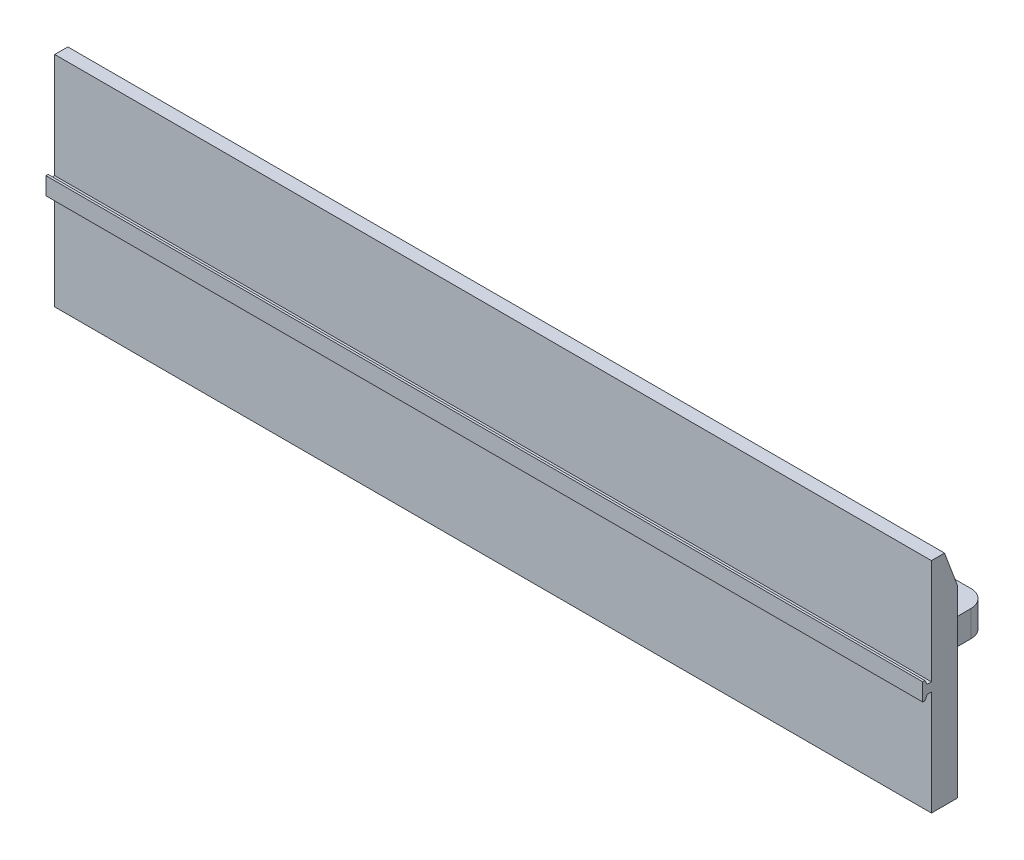
ISO-10303-21;
HEADER;
FILE_DESCRIPTION(('STEP AP214'),'2;1');
FILE_NAME('part.step','',(''),(''),'','','');
FILE_SCHEMA(('AUTOMOTIVE_DESIGN { 1 0 10303 214 1 1 1 1 }'));
ENDSEC;
DATA;
#1=APPLICATION_CONTEXT('core data for automotive mechanical design processes');
#2=APPLICATION_PROTOCOL_DEFINITION('international standard','automotive_design',2000,#1);
#3=PRODUCT_CONTEXT('',#1,'mechanical');
#4=PRODUCT('Part','Part','',(#3));
#5=PRODUCT_RELATED_PRODUCT_CATEGORY('part','',(#4));
#6=PRODUCT_DEFINITION_FORMATION('','',#4);
#7=PRODUCT_DEFINITION_CONTEXT('part definition',#1,'design');
#8=PRODUCT_DEFINITION('design','',#6,#7);
#9=PRODUCT_DEFINITION_SHAPE('','',#8);
#10=(LENGTH_UNIT() NAMED_UNIT(*) SI_UNIT(.MILLI.,.METRE.));
#11=(NAMED_UNIT(*) PLANE_ANGLE_UNIT() SI_UNIT($,.RADIAN.));
#12=(NAMED_UNIT(*) SI_UNIT($,.STERADIAN.) SOLID_ANGLE_UNIT());
#13=UNCERTAINTY_MEASURE_WITH_UNIT(LENGTH_MEASURE(1.E-05),#10,'distance_accuracy_value','');
#14=(GEOMETRIC_REPRESENTATION_CONTEXT(3) GLOBAL_UNCERTAINTY_ASSIGNED_CONTEXT((#13)) GLOBAL_UNIT_ASSIGNED_CONTEXT((#10,
#11,#12)) REPRESENTATION_CONTEXT('',''));
#15=CARTESIAN_POINT('',(0.,0.,0.));
#16=DIRECTION('',(0.,0.,1.));
#17=DIRECTION('',(1.,0.,0.));
#18=AXIS2_PLACEMENT_3D('',#15,#16,#17);
#19=CARTESIAN_POINT('',(24.9999999999992,80.,74.9999999999982));
#20=DIRECTION('',(0.,1.,0.));
#21=DIRECTION('',(0.,0.,1.));
#22=AXIS2_PLACEMENT_3D('',#19,#20,#21);
#23=PLANE('',#22);
#24=DIRECTION('',(1.,0.,0.));
#25=VECTOR('',#24,1.);
#26=CARTESIAN_POINT('',(24.9999999999997,80.,-110.000000000002));
#27=LINE('',#26,#25);
#28=CARTESIAN_POINT('',(195.,80.,-110.000000000001));
#29=VERTEX_POINT('',#28);
#30=CARTESIAN_POINT('',(306.25,80.,-110.000000000001));
#31=VERTEX_POINT('',#30);
#32=EDGE_CURVE('E425',#29,#31,#27,.T.);
#33=ORIENTED_EDGE('',*,*,#32,.F.);
#34=CARTESIAN_POINT('',(195.,80.,-90.0000000000015));
#35=DIRECTION('',(0.,1.,0.));
#36=DIRECTION('',(0.,0.,1.));
#37=AXIS2_PLACEMENT_3D('',#34,#35,#36);
#38=CIRCLE('',#37,20.);
#39=CARTESIAN_POINT('',(175.,80.,-90.0000000000014));
#40=VERTEX_POINT('',#39);
#41=EDGE_CURVE('E455',#29,#40,#38,.T.);
#42=ORIENTED_EDGE('',*,*,#41,.T.);
#43=DIRECTION('',(0.,0.,-1.));
#44=VECTOR('',#43,1.);
#45=CARTESIAN_POINT('',(175.,80.,74.9999999999982));
#46=LINE('',#45,#44);
#47=CARTESIAN_POINT('',(175.,80.,74.9999999999982));
#48=VERTEX_POINT('',#47);
#49=EDGE_CURVE('E314',#48,#40,#46,.T.);
#50=ORIENTED_EDGE('',*,*,#49,.F.);
#51=DIRECTION('',(1.,0.,0.));
#52=VECTOR('',#51,1.);
#53=CARTESIAN_POINT('',(24.9999999999992,80.,74.9999999999982));
#54=LINE('',#53,#52);
#55=CARTESIAN_POINT('',(240.625,80.,74.9999999999987));
#56=VERTEX_POINT('',#55);
#57=EDGE_CURVE('E418',#48,#56,#54,.T.);
#58=ORIENTED_EDGE('',*,*,#57,.T.);
#59=DIRECTION('',(0.,0.,-1.));
#60=VECTOR('',#59,1.);
#61=CARTESIAN_POINT('',(240.625,80.,74.9999999999982));
#62=LINE('',#61,#60);
#63=CARTESIAN_POINT('',(240.625,80.,15.0000000000006));
#64=VERTEX_POINT('',#63);
#65=EDGE_CURVE('E250',#56,#64,#62,.T.);
#66=ORIENTED_EDGE('',*,*,#65,.T.);
#67=DIRECTION('',(1.,0.,0.));
#68=VECTOR('',#67,1.);
#69=CARTESIAN_POINT('',(24.9999999999992,80.,15.0000000000006));
#70=LINE('',#69,#68);
#71=CARTESIAN_POINT('',(260.625,80.,15.0000000000006));
#72=VERTEX_POINT('',#71);
#73=EDGE_CURVE('E263',#72,#64,#70,.F.);
#74=ORIENTED_EDGE('',*,*,#73,.F.);
#75=DIRECTION('',(0.,0.,-1.));
#76=VECTOR('',#75,1.);
#77=CARTESIAN_POINT('',(260.625,80.,74.9999999999982));
#78=LINE('',#77,#76);
#79=CARTESIAN_POINT('',(260.625,80.,74.9999999999987));
#80=VERTEX_POINT('',#79);
#81=EDGE_CURVE('E269',#80,#72,#78,.T.);
#82=ORIENTED_EDGE('',*,*,#81,.F.);
#83=CARTESIAN_POINT('',(326.25,80.,75.0000000000004));
#84=VERTEX_POINT('',#83);
#85=EDGE_CURVE('E420',#80,#84,#54,.T.);
#86=ORIENTED_EDGE('',*,*,#85,.T.);
#87=DIRECTION('',(0.,0.,1.));
#88=VECTOR('',#87,1.);
#89=CARTESIAN_POINT('',(326.25,80.,74.9999999999982));
#90=LINE('',#89,#88);
#91=CARTESIAN_POINT('',(326.25,80.,-90.0000000000012));
#92=VERTEX_POINT('',#91);
#93=EDGE_CURVE('E332',#92,#84,#90,.T.);
#94=ORIENTED_EDGE('',*,*,#93,.F.);
#95=CARTESIAN_POINT('',(306.25,80.,-90.0000000000012));
#96=DIRECTION('',(0.,1.,0.));
#97=DIRECTION('',(0.,0.,1.));
#98=AXIS2_PLACEMENT_3D('',#95,#96,#97);
#99=CIRCLE('',#98,20.);
#100=EDGE_CURVE('E453',#92,#31,#99,.T.);
#101=ORIENTED_EDGE('',*,*,#100,.T.);
#102=EDGE_LOOP('',(#33,#42,#50,#58,#66,#74,#82,#86,#94,#101));
#103=FACE_BOUND('',#102,.T.);
#104=ADVANCED_FACE('F41',(#103),#23,.T.);
#105=CARTESIAN_POINT('',(24.9999999999997,50.,-110.000000000002));
#106=DIRECTION('',(0.,0.,-1.));
#107=DIRECTION('',(-1.,0.,0.));
#108=AXIS2_PLACEMENT_3D('',#105,#106,#107);
#109=PLANE('',#108);
#110=DIRECTION('',(1.,0.,0.));
#111=VECTOR('',#110,1.);
#112=CARTESIAN_POINT('',(24.9999999999997,50.,-110.000000000002));
#113=LINE('',#112,#111);
#114=CARTESIAN_POINT('',(195.,50.,-110.000000000001));
#115=VERTEX_POINT('',#114);
#116=CARTESIAN_POINT('',(306.25,50.,-110.000000000001));
#117=VERTEX_POINT('',#116);
#118=EDGE_CURVE('E426',#115,#117,#113,.T.);
#119=ORIENTED_EDGE('',*,*,#118,.F.);
#120=DIRECTION('',(0.,1.,0.));
#121=VECTOR('',#120,1.);
#122=CARTESIAN_POINT('',(195.,80.,-110.000000000001));
#123=LINE('',#122,#121);
#124=EDGE_CURVE('E450',#115,#29,#123,.T.);
#125=ORIENTED_EDGE('',*,*,#124,.T.);
#126=ORIENTED_EDGE('',*,*,#32,.T.);
#127=DIRECTION('',(0.,1.,0.));
#128=VECTOR('',#127,1.);
#129=CARTESIAN_POINT('',(306.25,50.,-110.000000000001));
#130=LINE('',#129,#128);
#131=EDGE_CURVE('E415',#31,#117,#130,.F.);
#132=ORIENTED_EDGE('',*,*,#131,.T.);
#133=EDGE_LOOP('',(#119,#125,#126,#132));
#134=FACE_BOUND('',#133,.T.);
#135=ADVANCED_FACE('F530',(#134),#109,.T.);
#136=CARTESIAN_POINT('',(24.9999999999992,300.,104.999999999998));
#137=DIRECTION('',(0.,1.,0.));
#138=DIRECTION('',(0.,0.,1.));
#139=AXIS2_PLACEMENT_3D('',#136,#137,#138);
#140=PLANE('',#139);
#141=DIRECTION('',(0.,0.,1.));
#142=VECTOR('',#141,1.);
#143=CARTESIAN_POINT('',(1027.5,300.,105.));
#144=LINE('',#143,#142);
#145=CARTESIAN_POINT('',(1027.5,300.,90.0000000000003));
#146=VERTEX_POINT('',#145);
#147=CARTESIAN_POINT('',(1027.5,300.,105.));
#148=VERTEX_POINT('',#147);
#149=EDGE_CURVE('E334',#146,#148,#144,.T.);
#150=ORIENTED_EDGE('',*,*,#149,.F.);
#151=DIRECTION('',(1.,0.,0.));
#152=VECTOR('',#151,1.);
#153=CARTESIAN_POINT('',(24.9999999999992,300.,89.9999999999981));
#154=LINE('',#153,#152);
#155=CARTESIAN_POINT('',(24.9999999999992,300.,89.9999999999981));
#156=VERTEX_POINT('',#155);
#157=EDGE_CURVE('E413',#156,#146,#154,.T.);
#158=ORIENTED_EDGE('',*,*,#157,.F.);
#159=DIRECTION('',(0.,0.,1.));
#160=VECTOR('',#159,1.);
#161=CARTESIAN_POINT('',(24.9999999999992,300.,104.999999999998));
#162=LINE('',#161,#160);
#163=CARTESIAN_POINT('',(24.9999999999992,300.,104.999999999998));
#164=VERTEX_POINT('',#163);
#165=EDGE_CURVE('E335',#156,#164,#162,.T.);
#166=ORIENTED_EDGE('',*,*,#165,.T.);
#167=DIRECTION('',(1.,0.,0.));
#168=VECTOR('',#167,1.);
#169=CARTESIAN_POINT('',(24.9999999999992,300.,104.999999999998));
#170=LINE('',#169,#168);
#171=EDGE_CURVE('E375',#164,#148,#170,.T.);
#172=ORIENTED_EDGE('',*,*,#171,.T.);
#173=EDGE_LOOP('',(#150,#158,#166,#172));
#174=FACE_BOUND('',#173,.T.);
#175=ADVANCED_FACE('F558',(#174),#140,.T.);
#176=CARTESIAN_POINT('',(24.9999999999992,300.,89.9999999999981));
#177=DIRECTION('',(0.,0.351123441588388,-0.936329177569046));
#178=DIRECTION('',(0.,0.936329177569046,0.351123441588388));
#179=AXIS2_PLACEMENT_3D('',#176,#177,#178);
#180=PLANE('',#179);
#181=DIRECTION('',(0.,0.936329177569046,0.351123441588388));
#182=VECTOR('',#181,1.);
#183=CARTESIAN_POINT('',(1027.5,300.,90.0000000000003));
#184=LINE('',#183,#182);
#185=CARTESIAN_POINT('',(1027.5,260.,75.0000000000004));
#186=VERTEX_POINT('',#185);
#187=EDGE_CURVE('E339',#186,#146,#184,.T.);
#188=ORIENTED_EDGE('',*,*,#187,.F.);
#189=DIRECTION('',(1.,0.,0.));
#190=VECTOR('',#189,1.);
#191=CARTESIAN_POINT('',(24.9999999999992,260.,74.9999999999982));
#192=LINE('',#191,#190);
#193=CARTESIAN_POINT('',(24.9999999999992,260.,74.9999999999982));
#194=VERTEX_POINT('',#193);
#195=EDGE_CURVE('E416',#194,#186,#192,.T.);
#196=ORIENTED_EDGE('',*,*,#195,.F.);
#197=DIRECTION('',(0.,0.936329177569046,0.351123441588388));
#198=VECTOR('',#197,1.);
#199=CARTESIAN_POINT('',(24.9999999999992,300.,89.9999999999981));
#200=LINE('',#199,#198);
#201=EDGE_CURVE('E372',#194,#156,#200,.T.);
#202=ORIENTED_EDGE('',*,*,#201,.T.);
#203=ORIENTED_EDGE('',*,*,#157,.T.);
#204=EDGE_LOOP('',(#188,#196,#202,#203));
#205=FACE_BOUND('',#204,.T.);
#206=ADVANCED_FACE('F566',(#205),#180,.T.);
#207=CARTESIAN_POINT('',(24.9999999999992,260.,74.9999999999982));
#208=DIRECTION('',(0.,0.,-1.));
#209=DIRECTION('',(-1.,0.,0.));
#210=AXIS2_PLACEMENT_3D('',#207,#208,#209);
#211=PLANE('',#210);
#212=DIRECTION('',(0.,-1.,0.));
#213=VECTOR('',#212,1.);
#214=CARTESIAN_POINT('',(260.625,260.,74.9999999999987));
#215=LINE('',#214,#213);
#216=CARTESIAN_POINT('',(260.625,179.999999999997,74.9999999999987));
#217=VERTEX_POINT('',#216);
#218=EDGE_CURVE('E268',#217,#80,#215,.T.);
#219=ORIENTED_EDGE('',*,*,#218,.F.);
#220=DIRECTION('',(-1.,0.,0.));
#221=VECTOR('',#220,1.);
#222=CARTESIAN_POINT('',(24.9999999999996,179.999999999996,74.9999999999982));
#223=LINE('',#222,#221);
#224=CARTESIAN_POINT('',(240.625,179.999999999997,74.9999999999987));
#225=VERTEX_POINT('',#224);
#226=EDGE_CURVE('E260',#225,#217,#223,.F.);
#227=ORIENTED_EDGE('',*,*,#226,.F.);
#228=DIRECTION('',(0.,-1.,0.));
#229=VECTOR('',#228,1.);
#230=CARTESIAN_POINT('',(240.625,260.,74.9999999999987));
#231=LINE('',#230,#229);
#232=EDGE_CURVE('E245',#225,#56,#231,.T.);
#233=ORIENTED_EDGE('',*,*,#232,.T.);
#234=ORIENTED_EDGE('',*,*,#57,.F.);
#235=DIRECTION('',(0.,1.,0.));
#236=VECTOR('',#235,1.);
#237=CARTESIAN_POINT('',(175.,50.,74.9999999999982));
#238=LINE('',#237,#236);
#239=CARTESIAN_POINT('',(175.,50.,74.9999999999982));
#240=VERTEX_POINT('',#239);
#241=EDGE_CURVE('E304',#240,#48,#238,.T.);
#242=ORIENTED_EDGE('',*,*,#241,.F.);
#243=DIRECTION('',(1.,0.,0.));
#244=VECTOR('',#243,1.);
#245=CARTESIAN_POINT('',(24.9999999999997,50.,74.9999999999982));
#246=LINE('',#245,#244);
#247=CARTESIAN_POINT('',(24.9999999999992,50.,74.9999999999982));
#248=VERTEX_POINT('',#247);
#249=EDGE_CURVE('E297',#248,#240,#246,.T.);
#250=ORIENTED_EDGE('',*,*,#249,.F.);
#251=DIRECTION('',(0.,1.,0.));
#252=VECTOR('',#251,1.);
#253=CARTESIAN_POINT('',(24.9999999999992,260.,74.9999999999982));
#254=LINE('',#253,#252);
#255=EDGE_CURVE('E369',#248,#194,#254,.T.);
#256=ORIENTED_EDGE('',*,*,#255,.T.);
#257=ORIENTED_EDGE('',*,*,#195,.T.);
#258=DIRECTION('',(0.,1.,0.));
#259=VECTOR('',#258,1.);
#260=CARTESIAN_POINT('',(1027.5,260.,75.0000000000004));
#261=LINE('',#260,#259);
#262=CARTESIAN_POINT('',(1027.5,50.,75.0000000000005));
#263=VERTEX_POINT('',#262);
#264=EDGE_CURVE('E408',#263,#186,#261,.T.);
#265=ORIENTED_EDGE('',*,*,#264,.F.);
#266=DIRECTION('',(1.,0.,0.));
#267=VECTOR('',#266,1.);
#268=CARTESIAN_POINT('',(1027.5,50.,75.0000000000005));
#269=LINE('',#268,#267);
#270=CARTESIAN_POINT('',(877.5,50.,75.0000000000004));
#271=VERTEX_POINT('',#270);
#272=EDGE_CURVE('E309',#271,#263,#269,.T.);
#273=ORIENTED_EDGE('',*,*,#272,.F.);
#274=DIRECTION('',(0.,1.,0.));
#275=VECTOR('',#274,1.);
#276=CARTESIAN_POINT('',(877.5,50.,75.0000000000004));
#277=LINE('',#276,#275);
#278=CARTESIAN_POINT('',(877.5,80.,75.0000000000004));
#279=VERTEX_POINT('',#278);
#280=EDGE_CURVE('E296',#271,#279,#277,.T.);
#281=ORIENTED_EDGE('',*,*,#280,.T.);
#282=CARTESIAN_POINT('',(811.875,80.,75.0000000000004));
#283=VERTEX_POINT('',#282);
#284=EDGE_CURVE('E495',#283,#279,#54,.T.);
#285=ORIENTED_EDGE('',*,*,#284,.F.);
#286=DIRECTION('',(0.,-1.,0.));
#287=VECTOR('',#286,1.);
#288=CARTESIAN_POINT('',(811.875,260.,75.));
#289=LINE('',#288,#287);
#290=CARTESIAN_POINT('',(811.875,179.999999999999,74.9999999999999));
#291=VERTEX_POINT('',#290);
#292=EDGE_CURVE('E289',#291,#283,#289,.T.);
#293=ORIENTED_EDGE('',*,*,#292,.F.);
#294=DIRECTION('',(1.,0.,0.));
#295=VECTOR('',#294,1.);
#296=CARTESIAN_POINT('',(24.9999999999995,179.999999999996,74.9999999999982));
#297=LINE('',#296,#295);
#298=CARTESIAN_POINT('',(791.875,179.999999999999,74.9999999999999));
#299=VERTEX_POINT('',#298);
#300=EDGE_CURVE('E294',#299,#291,#297,.T.);
#301=ORIENTED_EDGE('',*,*,#300,.F.);
#302=DIRECTION('',(0.,-1.,0.));
#303=VECTOR('',#302,1.);
#304=CARTESIAN_POINT('',(791.875,260.,74.9999999999999));
#305=LINE('',#304,#303);
#306=CARTESIAN_POINT('',(791.875,80.,75.0000000000004));
#307=VERTEX_POINT('',#306);
#308=EDGE_CURVE('E284',#299,#307,#305,.T.);
#309=ORIENTED_EDGE('',*,*,#308,.T.);
#310=CARTESIAN_POINT('',(726.25,80.,75.0000000000004));
#311=VERTEX_POINT('',#310);
#312=EDGE_CURVE('E421',#311,#307,#54,.T.);
#313=ORIENTED_EDGE('',*,*,#312,.F.);
#314=DIRECTION('',(0.,1.,0.));
#315=VECTOR('',#314,1.);
#316=CARTESIAN_POINT('',(726.25,50.,75.0000000000004));
#317=LINE('',#316,#315);
#318=CARTESIAN_POINT('',(726.25,50.,75.0000000000004));
#319=VERTEX_POINT('',#318);
#320=EDGE_CURVE('E326',#319,#311,#317,.T.);
#321=ORIENTED_EDGE('',*,*,#320,.F.);
#322=DIRECTION('',(1.,0.,0.));
#323=VECTOR('',#322,1.);
#324=CARTESIAN_POINT('',(326.25,50.,75.0000000000004));
#325=LINE('',#324,#323);
#326=CARTESIAN_POINT('',(326.25,50.,75.0000000000004));
#327=VERTEX_POINT('',#326);
#328=EDGE_CURVE('E319',#327,#319,#325,.T.);
#329=ORIENTED_EDGE('',*,*,#328,.F.);
#330=DIRECTION('',(0.,1.,0.));
#331=VECTOR('',#330,1.);
#332=CARTESIAN_POINT('',(326.25,50.,75.0000000000004));
#333=LINE('',#332,#331);
#334=EDGE_CURVE('E325',#327,#84,#333,.T.);
#335=ORIENTED_EDGE('',*,*,#334,.T.);
#336=ORIENTED_EDGE('',*,*,#85,.F.);
#337=EDGE_LOOP('',(#219,#227,#233,#234,#242,#250,#256,#257,#265,#273,#281,#285,#293,#301,#309,
#313,#321,#329,#335,#336));
#338=FACE_BOUND('',#337,.T.);
#339=ADVANCED_FACE('F266',(#338),#211,.T.);
#340=CARTESIAN_POINT('',(746.25,80.,-110.));
#341=VERTEX_POINT('',#340);
#342=CARTESIAN_POINT('',(857.5,80.,-110.));
#343=VERTEX_POINT('',#342);
#344=EDGE_CURVE('E422',#341,#343,#27,.T.);
#345=ORIENTED_EDGE('',*,*,#344,.F.);
#346=CARTESIAN_POINT('',(746.25,80.,-90.0000000000002));
#347=DIRECTION('',(0.,1.,0.));
#348=DIRECTION('',(0.,0.,1.));
#349=AXIS2_PLACEMENT_3D('',#346,#347,#348);
#350=CIRCLE('',#349,20.);
#351=CARTESIAN_POINT('',(726.25,80.,-90.0000000000002));
#352=VERTEX_POINT('',#351);
#353=EDGE_CURVE('E56',#341,#352,#350,.T.);
#354=ORIENTED_EDGE('',*,*,#353,.T.);
#355=DIRECTION('',(0.,0.,-1.));
#356=VECTOR('',#355,1.);
#357=CARTESIAN_POINT('',(726.25,80.,74.9999999999982));
#358=LINE('',#357,#356);
#359=EDGE_CURVE('E328',#311,#352,#358,.T.);
#360=ORIENTED_EDGE('',*,*,#359,.F.);
#361=ORIENTED_EDGE('',*,*,#312,.T.);
#362=DIRECTION('',(0.,0.,-1.));
#363=VECTOR('',#362,1.);
#364=CARTESIAN_POINT('',(791.875,80.,74.9999999999982));
#365=LINE('',#364,#363);
#366=CARTESIAN_POINT('',(791.875,80.,15.0000000000005));
#367=VERTEX_POINT('',#366);
#368=EDGE_CURVE('E279',#307,#367,#365,.T.);
#369=ORIENTED_EDGE('',*,*,#368,.T.);
#370=DIRECTION('',(-1.,0.,0.));
#371=VECTOR('',#370,1.);
#372=CARTESIAN_POINT('',(24.9999999999992,80.,15.0000000000005));
#373=LINE('',#372,#371);
#374=CARTESIAN_POINT('',(811.875,80.,15.0000000000005));
#375=VERTEX_POINT('',#374);
#376=EDGE_CURVE('E291',#375,#367,#373,.T.);
#377=ORIENTED_EDGE('',*,*,#376,.F.);
#378=DIRECTION('',(0.,0.,-1.));
#379=VECTOR('',#378,1.);
#380=CARTESIAN_POINT('',(811.875,80.,74.9999999999982));
#381=LINE('',#380,#379);
#382=EDGE_CURVE('E287',#283,#375,#381,.T.);
#383=ORIENTED_EDGE('',*,*,#382,.F.);
#384=ORIENTED_EDGE('',*,*,#284,.T.);
#385=DIRECTION('',(0.,0.,1.));
#386=VECTOR('',#385,1.);
#387=CARTESIAN_POINT('',(877.5,80.,74.9999999999972));
#388=LINE('',#387,#386);
#389=CARTESIAN_POINT('',(877.5,80.,-90.));
#390=VERTEX_POINT('',#389);
#391=EDGE_CURVE('E306',#390,#279,#388,.T.);
#392=ORIENTED_EDGE('',*,*,#391,.F.);
#393=CARTESIAN_POINT('',(857.5,80.,-90.));
#394=DIRECTION('',(0.,1.,0.));
#395=DIRECTION('',(0.,0.,1.));
#396=AXIS2_PLACEMENT_3D('',#393,#394,#395);
#397=CIRCLE('',#396,20.);
#398=EDGE_CURVE('E64',#390,#343,#397,.T.);
#399=ORIENTED_EDGE('',*,*,#398,.T.);
#400=EDGE_LOOP('',(#345,#354,#360,#361,#369,#377,#383,#384,#392,#399));
#401=FACE_BOUND('',#400,.T.);
#402=ADVANCED_FACE('F490',(#401),#23,.T.);
#403=CARTESIAN_POINT('',(746.25,50.,-110.));
#404=VERTEX_POINT('',#403);
#405=CARTESIAN_POINT('',(857.5,50.,-110.));
#406=VERTEX_POINT('',#405);
#407=EDGE_CURVE('E427',#404,#406,#113,.T.);
#408=ORIENTED_EDGE('',*,*,#407,.F.);
#409=DIRECTION('',(0.,1.,0.));
#410=VECTOR('',#409,1.);
#411=CARTESIAN_POINT('',(746.25,80.,-110.));
#412=LINE('',#411,#410);
#413=EDGE_CURVE('E472',#404,#341,#412,.T.);
#414=ORIENTED_EDGE('',*,*,#413,.T.);
#415=ORIENTED_EDGE('',*,*,#344,.T.);
#416=DIRECTION('',(0.,1.,0.));
#417=VECTOR('',#416,1.);
#418=CARTESIAN_POINT('',(857.5,50.,-110.));
#419=LINE('',#418,#417);
#420=EDGE_CURVE('E470',#343,#406,#419,.F.);
#421=ORIENTED_EDGE('',*,*,#420,.T.);
#422=EDGE_LOOP('',(#408,#414,#415,#421));
#423=FACE_BOUND('',#422,.T.);
#424=ADVANCED_FACE('F489',(#423),#109,.T.);
#425=CARTESIAN_POINT('',(24.9999999999992,50.,74.9999999999982));
#426=DIRECTION('',(0.,-1.,0.));
#427=DIRECTION('',(0.,0.,-1.));
#428=AXIS2_PLACEMENT_3D('',#425,#426,#427);
#429=PLANE('',#428);
#430=DIRECTION('',(0.,0.,-1.));
#431=VECTOR('',#430,1.);
#432=CARTESIAN_POINT('',(175.,50.,-110.000000000002));
#433=LINE('',#432,#431);
#434=CARTESIAN_POINT('',(175.,50.,-90.0000000000015));
#435=VERTEX_POINT('',#434);
#436=EDGE_CURVE('E300',#240,#435,#433,.T.);
#437=ORIENTED_EDGE('',*,*,#436,.T.);
#438=CARTESIAN_POINT('',(195.,50.,-90.0000000000015));
#439=DIRECTION('',(0.,-1.,0.));
#440=DIRECTION('',(0.,0.,-1.));
#441=AXIS2_PLACEMENT_3D('',#438,#439,#440);
#442=CIRCLE('',#441,20.);
#443=EDGE_CURVE('E465',#435,#115,#442,.T.);
#444=ORIENTED_EDGE('',*,*,#443,.T.);
#445=ORIENTED_EDGE('',*,*,#118,.T.);
#446=CARTESIAN_POINT('',(306.25,50.,-90.0000000000012));
#447=DIRECTION('',(0.,-1.,0.));
#448=DIRECTION('',(0.,0.,-1.));
#449=AXIS2_PLACEMENT_3D('',#446,#447,#448);
#450=CIRCLE('',#449,20.);
#451=CARTESIAN_POINT('',(326.25,50.,-90.0000000000012));
#452=VERTEX_POINT('',#451);
#453=EDGE_CURVE('E463',#117,#452,#450,.T.);
#454=ORIENTED_EDGE('',*,*,#453,.T.);
#455=DIRECTION('',(0.,0.,1.));
#456=VECTOR('',#455,1.);
#457=CARTESIAN_POINT('',(326.25,50.,-110.000000000002));
#458=LINE('',#457,#456);
#459=EDGE_CURVE('E317',#452,#327,#458,.T.);
#460=ORIENTED_EDGE('',*,*,#459,.T.);
#461=ORIENTED_EDGE('',*,*,#328,.T.);
#462=DIRECTION('',(0.,0.,-1.));
#463=VECTOR('',#462,1.);
#464=CARTESIAN_POINT('',(726.25,50.,-110.000000000002));
#465=LINE('',#464,#463);
#466=CARTESIAN_POINT('',(726.25,50.,-90.0000000000002));
#467=VERTEX_POINT('',#466);
#468=EDGE_CURVE('E322',#319,#467,#465,.T.);
#469=ORIENTED_EDGE('',*,*,#468,.T.);
#470=CARTESIAN_POINT('',(746.25,50.,-90.0000000000002));
#471=DIRECTION('',(0.,-1.,0.));
#472=DIRECTION('',(0.,0.,-1.));
#473=AXIS2_PLACEMENT_3D('',#470,#471,#472);
#474=CIRCLE('',#473,20.);
#475=EDGE_CURVE('E461',#467,#404,#474,.T.);
#476=ORIENTED_EDGE('',*,*,#475,.T.);
#477=ORIENTED_EDGE('',*,*,#407,.T.);
#478=CARTESIAN_POINT('',(857.5,50.,-90.));
#479=DIRECTION('',(0.,-1.,0.));
#480=DIRECTION('',(0.,0.,-1.));
#481=AXIS2_PLACEMENT_3D('',#478,#479,#480);
#482=CIRCLE('',#481,20.);
#483=CARTESIAN_POINT('',(877.5,50.,-90.));
#484=VERTEX_POINT('',#483);
#485=EDGE_CURVE('E459',#406,#484,#482,.T.);
#486=ORIENTED_EDGE('',*,*,#485,.T.);
#487=DIRECTION('',(0.,0.,1.));
#488=VECTOR('',#487,1.);
#489=CARTESIAN_POINT('',(877.5,50.,-110.));
#490=LINE('',#489,#488);
#491=EDGE_CURVE('E301',#484,#271,#490,.T.);
#492=ORIENTED_EDGE('',*,*,#491,.T.);
#493=ORIENTED_EDGE('',*,*,#272,.T.);
#494=DIRECTION('',(0.,0.,-1.));
#495=VECTOR('',#494,1.);
#496=CARTESIAN_POINT('',(1027.5,50.,75.0000000000005));
#497=LINE('',#496,#495);
#498=CARTESIAN_POINT('',(1027.5,50.,105.));
#499=VERTEX_POINT('',#498);
#500=EDGE_CURVE('E405',#499,#263,#497,.T.);
#501=ORIENTED_EDGE('',*,*,#500,.F.);
#502=DIRECTION('',(1.,0.,0.));
#503=VECTOR('',#502,1.);
#504=CARTESIAN_POINT('',(24.9999999999992,50.,104.999999999998));
#505=LINE('',#504,#503);
#506=CARTESIAN_POINT('',(24.9999999999992,50.,104.999999999998));
#507=VERTEX_POINT('',#506);
#508=EDGE_CURVE('E430',#507,#499,#505,.T.);
#509=ORIENTED_EDGE('',*,*,#508,.F.);
#510=DIRECTION('',(0.,0.,-1.));
#511=VECTOR('',#510,1.);
#512=CARTESIAN_POINT('',(24.9999999999992,50.,74.9999999999982));
#513=LINE('',#512,#511);
#514=EDGE_CURVE('E366',#507,#248,#513,.T.);
#515=ORIENTED_EDGE('',*,*,#514,.T.);
#516=ORIENTED_EDGE('',*,*,#249,.T.);
#517=EDGE_LOOP('',(#437,#444,#445,#454,#460,#461,#469,#476,#477,#486,#492,#493,#501,#509,#515,#516));
#518=FACE_BOUND('',#517,.T.);
#519=ADVANCED_FACE('F483',(#518),#429,.T.);
#520=CARTESIAN_POINT('',(24.9999999999992,170.,104.999999999998));
#521=DIRECTION('',(0.,0.,1.));
#522=DIRECTION('',(1.,0.,0.));
#523=AXIS2_PLACEMENT_3D('',#520,#521,#522);
#524=PLANE('',#523);
#525=DIRECTION('',(0.,-1.,0.));
#526=VECTOR('',#525,1.);
#527=CARTESIAN_POINT('',(1027.5,170.,105.));
#528=LINE('',#527,#526);
#529=CARTESIAN_POINT('',(1027.5,170.,105.));
#530=VERTEX_POINT('',#529);
#531=EDGE_CURVE('E402',#530,#499,#528,.T.);
#532=ORIENTED_EDGE('',*,*,#531,.F.);
#533=DIRECTION('',(1.,0.,0.));
#534=VECTOR('',#533,1.);
#535=CARTESIAN_POINT('',(24.9999999999992,170.,104.999999999998));
#536=LINE('',#535,#534);
#537=CARTESIAN_POINT('',(24.9999999999992,170.,104.999999999998));
#538=VERTEX_POINT('',#537);
#539=EDGE_CURVE('E432',#538,#530,#536,.T.);
#540=ORIENTED_EDGE('',*,*,#539,.F.);
#541=DIRECTION('',(0.,-1.,0.));
#542=VECTOR('',#541,1.);
#543=CARTESIAN_POINT('',(24.9999999999992,170.,104.999999999998));
#544=LINE('',#543,#542);
#545=EDGE_CURVE('E363',#538,#507,#544,.T.);
#546=ORIENTED_EDGE('',*,*,#545,.T.);
#547=ORIENTED_EDGE('',*,*,#508,.T.);
#548=EDGE_LOOP('',(#532,#540,#546,#547));
#549=FACE_BOUND('',#548,.T.);
#550=ADVANCED_FACE('F509',(#549),#524,.T.);
#551=CARTESIAN_POINT('',(24.9999999999992,170.,109.999999999998));
#552=DIRECTION('',(0.,-1.,0.));
#553=DIRECTION('',(0.,0.,-1.));
#554=AXIS2_PLACEMENT_3D('',#551,#552,#553);
#555=PLANE('',#554);
#556=DIRECTION('',(0.,0.,-1.));
#557=VECTOR('',#556,1.);
#558=CARTESIAN_POINT('',(1027.5,170.,110.));
#559=LINE('',#558,#557);
#560=CARTESIAN_POINT('',(1027.5,170.,110.));
#561=VERTEX_POINT('',#560);
#562=EDGE_CURVE('E399',#561,#530,#559,.T.);
#563=ORIENTED_EDGE('',*,*,#562,.F.);
#564=DIRECTION('',(1.,0.,0.));
#565=VECTOR('',#564,1.);
#566=CARTESIAN_POINT('',(24.9999999999992,170.,109.999999999998));
#567=LINE('',#566,#565);
#568=CARTESIAN_POINT('',(24.9999999999992,170.,109.999999999998));
#569=VERTEX_POINT('',#568);
#570=EDGE_CURVE('E434',#569,#561,#567,.T.);
#571=ORIENTED_EDGE('',*,*,#570,.F.);
#572=DIRECTION('',(0.,0.,-1.));
#573=VECTOR('',#572,1.);
#574=CARTESIAN_POINT('',(24.9999999999992,170.,109.999999999998));
#575=LINE('',#574,#573);
#576=EDGE_CURVE('E360',#569,#538,#575,.T.);
#577=ORIENTED_EDGE('',*,*,#576,.T.);
#578=ORIENTED_EDGE('',*,*,#539,.T.);
#579=EDGE_LOOP('',(#563,#571,#577,#578));
#580=FACE_BOUND('',#579,.T.);
#581=ADVANCED_FACE('F798',(#580),#555,.T.);
#582=CARTESIAN_POINT('',(24.9999999999992,165.,112.499999999998));
#583=DIRECTION('',(0.,-0.44721359549996,-0.894427190999915));
#584=DIRECTION('',(0.,0.894427190999915,-0.44721359549996));
#585=AXIS2_PLACEMENT_3D('',#582,#583,#584);
#586=PLANE('',#585);
#587=DIRECTION('',(0.,0.894427190999915,-0.44721359549996));
#588=VECTOR('',#587,1.);
#589=CARTESIAN_POINT('',(1027.5,165.,112.5));
#590=LINE('',#589,#588);
#591=CARTESIAN_POINT('',(1027.5,165.,112.5));
#592=VERTEX_POINT('',#591);
#593=EDGE_CURVE('E396',#592,#561,#590,.T.);
#594=ORIENTED_EDGE('',*,*,#593,.F.);
#595=DIRECTION('',(1.,0.,0.));
#596=VECTOR('',#595,1.);
#597=CARTESIAN_POINT('',(24.9999999999992,165.,112.499999999998));
#598=LINE('',#597,#596);
#599=CARTESIAN_POINT('',(24.9999999999992,165.,112.499999999998));
#600=VERTEX_POINT('',#599);
#601=EDGE_CURVE('E436',#600,#592,#598,.T.);
#602=ORIENTED_EDGE('',*,*,#601,.F.);
#603=DIRECTION('',(0.,0.894427190999915,-0.44721359549996));
#604=VECTOR('',#603,1.);
#605=CARTESIAN_POINT('',(24.9999999999992,165.,112.499999999998));
#606=LINE('',#605,#604);
#607=EDGE_CURVE('E357',#600,#569,#606,.T.);
#608=ORIENTED_EDGE('',*,*,#607,.T.);
#609=ORIENTED_EDGE('',*,*,#570,.T.);
#610=EDGE_LOOP('',(#594,#602,#608,#609));
#611=FACE_BOUND('',#610,.T.);
#612=ADVANCED_FACE('F788',(#611),#586,.T.);
#613=CARTESIAN_POINT('',(24.9999999999992,165.,114.999999999998));
#614=DIRECTION('',(0.,-1.,0.));
#615=DIRECTION('',(0.,0.,-1.));
#616=AXIS2_PLACEMENT_3D('',#613,#614,#615);
#617=PLANE('',#616);
#618=DIRECTION('',(0.,0.,-1.));
#619=VECTOR('',#618,1.);
#620=CARTESIAN_POINT('',(1027.5,165.,115.));
#621=LINE('',#620,#619);
#622=CARTESIAN_POINT('',(1027.5,165.,115.));
#623=VERTEX_POINT('',#622);
#624=EDGE_CURVE('E393',#623,#592,#621,.T.);
#625=ORIENTED_EDGE('',*,*,#624,.F.);
#626=DIRECTION('',(1.,0.,0.));
#627=VECTOR('',#626,1.);
#628=CARTESIAN_POINT('',(24.9999999999992,165.,114.999999999998));
#629=LINE('',#628,#627);
#630=CARTESIAN_POINT('',(24.9999999999992,165.,114.999999999998));
#631=VERTEX_POINT('',#630);
#632=EDGE_CURVE('E438',#631,#623,#629,.T.);
#633=ORIENTED_EDGE('',*,*,#632,.F.);
#634=DIRECTION('',(0.,0.,-1.));
#635=VECTOR('',#634,1.);
#636=CARTESIAN_POINT('',(24.9999999999992,165.,114.999999999998));
#637=LINE('',#636,#635);
#638=EDGE_CURVE('E354',#631,#600,#637,.T.);
#639=ORIENTED_EDGE('',*,*,#638,.T.);
#640=ORIENTED_EDGE('',*,*,#601,.T.);
#641=EDGE_LOOP('',(#625,#633,#639,#640));
#642=FACE_BOUND('',#641,.T.);
#643=ADVANCED_FACE('F778',(#642),#617,.T.);
#644=CARTESIAN_POINT('',(24.9999999999992,185.,114.999999999998));
#645=DIRECTION('',(0.,0.,1.));
#646=DIRECTION('',(1.,0.,0.));
#647=AXIS2_PLACEMENT_3D('',#644,#645,#646);
#648=PLANE('',#647);
#649=DIRECTION('',(0.,-1.,0.));
#650=VECTOR('',#649,1.);
#651=CARTESIAN_POINT('',(1027.5,185.,115.));
#652=LINE('',#651,#650);
#653=CARTESIAN_POINT('',(1027.5,185.,115.));
#654=VERTEX_POINT('',#653);
#655=EDGE_CURVE('E390',#654,#623,#652,.T.);
#656=ORIENTED_EDGE('',*,*,#655,.F.);
#657=DIRECTION('',(1.,0.,0.));
#658=VECTOR('',#657,1.);
#659=CARTESIAN_POINT('',(24.9999999999992,185.,114.999999999998));
#660=LINE('',#659,#658);
#661=CARTESIAN_POINT('',(24.9999999999992,185.,114.999999999998));
#662=VERTEX_POINT('',#661);
#663=EDGE_CURVE('E440',#662,#654,#660,.T.);
#664=ORIENTED_EDGE('',*,*,#663,.F.);
#665=DIRECTION('',(0.,-1.,0.));
#666=VECTOR('',#665,1.);
#667=CARTESIAN_POINT('',(24.9999999999992,185.,114.999999999998));
#668=LINE('',#667,#666);
#669=EDGE_CURVE('E351',#662,#631,#668,.T.);
#670=ORIENTED_EDGE('',*,*,#669,.T.);
#671=ORIENTED_EDGE('',*,*,#632,.T.);
#672=EDGE_LOOP('',(#656,#664,#670,#671));
#673=FACE_BOUND('',#672,.T.);
#674=ADVANCED_FACE('F768',(#673),#648,.T.);
#675=CARTESIAN_POINT('',(24.9999999999992,185.,112.499999999998));
#676=DIRECTION('',(0.,1.,0.));
#677=DIRECTION('',(0.,0.,1.));
#678=AXIS2_PLACEMENT_3D('',#675,#676,#677);
#679=PLANE('',#678);
#680=DIRECTION('',(0.,0.,1.));
#681=VECTOR('',#680,1.);
#682=CARTESIAN_POINT('',(1027.5,185.,112.5));
#683=LINE('',#682,#681);
#684=CARTESIAN_POINT('',(1027.5,185.,112.5));
#685=VERTEX_POINT('',#684);
#686=EDGE_CURVE('E387',#685,#654,#683,.T.);
#687=ORIENTED_EDGE('',*,*,#686,.F.);
#688=DIRECTION('',(1.,0.,0.));
#689=VECTOR('',#688,1.);
#690=CARTESIAN_POINT('',(24.9999999999992,185.,112.499999999998));
#691=LINE('',#690,#689);
#692=CARTESIAN_POINT('',(24.9999999999992,185.,112.499999999998));
#693=VERTEX_POINT('',#692);
#694=EDGE_CURVE('E442',#693,#685,#691,.T.);
#695=ORIENTED_EDGE('',*,*,#694,.F.);
#696=DIRECTION('',(0.,0.,1.));
#697=VECTOR('',#696,1.);
#698=CARTESIAN_POINT('',(24.9999999999992,185.,112.499999999998));
#699=LINE('',#698,#697);
#700=EDGE_CURVE('E348',#693,#662,#699,.T.);
#701=ORIENTED_EDGE('',*,*,#700,.T.);
#702=ORIENTED_EDGE('',*,*,#663,.T.);
#703=EDGE_LOOP('',(#687,#695,#701,#702));
#704=FACE_BOUND('',#703,.T.);
#705=ADVANCED_FACE('F758',(#704),#679,.T.);
#706=CARTESIAN_POINT('',(24.9999999999992,180.,109.999999999998));
#707=DIRECTION('',(0.,0.447213595499956,-0.894427190999917));
#708=DIRECTION('',(0.,0.894427190999917,0.447213595499956));
#709=AXIS2_PLACEMENT_3D('',#706,#707,#708);
#710=PLANE('',#709);
#711=DIRECTION('',(0.,0.894427190999917,0.447213595499956));
#712=VECTOR('',#711,1.);
#713=CARTESIAN_POINT('',(1027.5,180.,110.));
#714=LINE('',#713,#712);
#715=CARTESIAN_POINT('',(1027.5,180.,110.));
#716=VERTEX_POINT('',#715);
#717=EDGE_CURVE('E384',#716,#685,#714,.T.);
#718=ORIENTED_EDGE('',*,*,#717,.F.);
#719=DIRECTION('',(1.,0.,0.));
#720=VECTOR('',#719,1.);
#721=CARTESIAN_POINT('',(24.9999999999992,180.,109.999999999998));
#722=LINE('',#721,#720);
#723=CARTESIAN_POINT('',(24.9999999999992,180.,109.999999999998));
#724=VERTEX_POINT('',#723);
#725=EDGE_CURVE('E444',#724,#716,#722,.T.);
#726=ORIENTED_EDGE('',*,*,#725,.F.);
#727=DIRECTION('',(0.,0.894427190999917,0.447213595499956));
#728=VECTOR('',#727,1.);
#729=CARTESIAN_POINT('',(24.9999999999992,180.,109.999999999998));
#730=LINE('',#729,#728);
#731=EDGE_CURVE('E345',#724,#693,#730,.T.);
#732=ORIENTED_EDGE('',*,*,#731,.T.);
#733=ORIENTED_EDGE('',*,*,#694,.T.);
#734=EDGE_LOOP('',(#718,#726,#732,#733));
#735=FACE_BOUND('',#734,.T.);
#736=ADVANCED_FACE('F748',(#735),#710,.T.);
#737=CARTESIAN_POINT('',(24.9999999999992,180.,104.999999999998));
#738=DIRECTION('',(0.,1.,0.));
#739=DIRECTION('',(0.,0.,1.));
#740=AXIS2_PLACEMENT_3D('',#737,#738,#739);
#741=PLANE('',#740);
#742=DIRECTION('',(0.,0.,1.));
#743=VECTOR('',#742,1.);
#744=CARTESIAN_POINT('',(1027.5,180.,105.));
#745=LINE('',#744,#743);
#746=CARTESIAN_POINT('',(1027.5,180.,105.));
#747=VERTEX_POINT('',#746);
#748=EDGE_CURVE('E381',#747,#716,#745,.T.);
#749=ORIENTED_EDGE('',*,*,#748,.F.);
#750=DIRECTION('',(1.,0.,0.));
#751=VECTOR('',#750,1.);
#752=CARTESIAN_POINT('',(24.9999999999992,180.,104.999999999998));
#753=LINE('',#752,#751);
#754=CARTESIAN_POINT('',(24.9999999999992,180.,104.999999999998));
#755=VERTEX_POINT('',#754);
#756=EDGE_CURVE('E446',#755,#747,#753,.T.);
#757=ORIENTED_EDGE('',*,*,#756,.F.);
#758=DIRECTION('',(0.,0.,1.));
#759=VECTOR('',#758,1.);
#760=CARTESIAN_POINT('',(24.9999999999992,180.,104.999999999998));
#761=LINE('',#760,#759);
#762=EDGE_CURVE('E342',#755,#724,#761,.T.);
#763=ORIENTED_EDGE('',*,*,#762,.T.);
#764=ORIENTED_EDGE('',*,*,#725,.T.);
#765=EDGE_LOOP('',(#749,#757,#763,#764));
#766=FACE_BOUND('',#765,.T.);
#767=ADVANCED_FACE('F738',(#766),#741,.T.);
#768=CARTESIAN_POINT('',(24.9999999999992,300.,104.999999999998));
#769=DIRECTION('',(0.,0.,1.));
#770=DIRECTION('',(1.,0.,0.));
#771=AXIS2_PLACEMENT_3D('',#768,#769,#770);
#772=PLANE('',#771);
#773=ORIENTED_EDGE('',*,*,#756,.T.);
#774=DIRECTION('',(0.,-1.,0.));
#775=VECTOR('',#774,1.);
#776=CARTESIAN_POINT('',(1027.5,300.,105.));
#777=LINE('',#776,#775);
#778=EDGE_CURVE('E378',#148,#747,#777,.T.);
#779=ORIENTED_EDGE('',*,*,#778,.F.);
#780=ORIENTED_EDGE('',*,*,#171,.F.);
#781=DIRECTION('',(0.,-1.,0.));
#782=VECTOR('',#781,1.);
#783=CARTESIAN_POINT('',(24.9999999999992,300.,104.999999999998));
#784=LINE('',#783,#782);
#785=EDGE_CURVE('E338',#164,#755,#784,.T.);
#786=ORIENTED_EDGE('',*,*,#785,.T.);
#787=EDGE_LOOP('',(#773,#779,#780,#786));
#788=FACE_BOUND('',#787,.T.);
#789=ADVANCED_FACE('F577',(#788),#772,.T.);
#790=CARTESIAN_POINT('',(24.9999999999992,0.,-2.22599716437344E-12));
#791=DIRECTION('',(-1.,0.,0.));
#792=DIRECTION('',(0.,0.,1.));
#793=AXIS2_PLACEMENT_3D('',#790,#791,#792);
#794=PLANE('',#793);
#795=ORIENTED_EDGE('',*,*,#255,.F.);
#796=ORIENTED_EDGE('',*,*,#514,.F.);
#797=ORIENTED_EDGE('',*,*,#545,.F.);
#798=ORIENTED_EDGE('',*,*,#576,.F.);
#799=ORIENTED_EDGE('',*,*,#607,.F.);
#800=ORIENTED_EDGE('',*,*,#638,.F.);
#801=ORIENTED_EDGE('',*,*,#669,.F.);
#802=ORIENTED_EDGE('',*,*,#700,.F.);
#803=ORIENTED_EDGE('',*,*,#731,.F.);
#804=ORIENTED_EDGE('',*,*,#762,.F.);
#805=ORIENTED_EDGE('',*,*,#785,.F.);
#806=ORIENTED_EDGE('',*,*,#165,.F.);
#807=ORIENTED_EDGE('',*,*,#201,.F.);
#808=EDGE_LOOP('',(#795,#796,#797,#798,#799,#800,#801,#802,#803,#804,#805,#806,#807));
#809=FACE_BOUND('',#808,.T.);
#810=ADVANCED_FACE('F513',(#809),#794,.T.);
#811=CARTESIAN_POINT('',(1027.5,0.,0.));
#812=DIRECTION('',(-1.,0.,0.));
#813=DIRECTION('',(0.,0.,1.));
#814=AXIS2_PLACEMENT_3D('',#811,#812,#813);
#815=PLANE('',#814);
#816=ORIENTED_EDGE('',*,*,#500,.T.);
#817=ORIENTED_EDGE('',*,*,#264,.T.);
#818=ORIENTED_EDGE('',*,*,#187,.T.);
#819=ORIENTED_EDGE('',*,*,#149,.T.);
#820=ORIENTED_EDGE('',*,*,#778,.T.);
#821=ORIENTED_EDGE('',*,*,#748,.T.);
#822=ORIENTED_EDGE('',*,*,#717,.T.);
#823=ORIENTED_EDGE('',*,*,#686,.T.);
#824=ORIENTED_EDGE('',*,*,#655,.T.);
#825=ORIENTED_EDGE('',*,*,#624,.T.);
#826=ORIENTED_EDGE('',*,*,#593,.T.);
#827=ORIENTED_EDGE('',*,*,#562,.T.);
#828=ORIENTED_EDGE('',*,*,#531,.T.);
#829=EDGE_LOOP('',(#816,#817,#818,#819,#820,#821,#822,#823,#824,#825,#826,#827,#828));
#830=FACE_BOUND('',#829,.T.);
#831=ADVANCED_FACE('F504',(#830),#815,.F.);
#832=CARTESIAN_POINT('',(326.25,50.,-110.000000000002));
#833=DIRECTION('',(-1.,0.,0.));
#834=DIRECTION('',(0.,0.,1.));
#835=AXIS2_PLACEMENT_3D('',#832,#833,#834);
#836=PLANE('',#835);
#837=ORIENTED_EDGE('',*,*,#459,.F.);
#838=DIRECTION('',(0.,1.,0.));
#839=VECTOR('',#838,1.);
#840=CARTESIAN_POINT('',(326.25,80.,-90.0000000000012));
#841=LINE('',#840,#839);
#842=EDGE_CURVE('E467',#452,#92,#841,.T.);
#843=ORIENTED_EDGE('',*,*,#842,.T.);
#844=ORIENTED_EDGE('',*,*,#93,.T.);
#845=ORIENTED_EDGE('',*,*,#334,.F.);
#846=EDGE_LOOP('',(#837,#843,#844,#845));
#847=FACE_BOUND('',#846,.T.);
#848=ADVANCED_FACE('F541',(#847),#836,.F.);
#849=CARTESIAN_POINT('',(726.25,50.,-110.000000000002));
#850=DIRECTION('',(1.,0.,0.));
#851=DIRECTION('',(0.,0.,-1.));
#852=AXIS2_PLACEMENT_3D('',#849,#850,#851);
#853=PLANE('',#852);
#854=ORIENTED_EDGE('',*,*,#359,.T.);
#855=DIRECTION('',(0.,1.,0.));
#856=VECTOR('',#855,1.);
#857=CARTESIAN_POINT('',(726.25,50.,-90.0000000000002));
#858=LINE('',#857,#856);
#859=EDGE_CURVE('E49',#352,#467,#858,.F.);
#860=ORIENTED_EDGE('',*,*,#859,.T.);
#861=ORIENTED_EDGE('',*,*,#468,.F.);
#862=ORIENTED_EDGE('',*,*,#320,.T.);
#863=EDGE_LOOP('',(#854,#860,#861,#862));
#864=FACE_BOUND('',#863,.T.);
#865=ADVANCED_FACE('F478',(#864),#853,.F.);
#866=CARTESIAN_POINT('',(877.5,50.,-110.));
#867=DIRECTION('',(-1.,0.,0.));
#868=DIRECTION('',(0.,0.,1.));
#869=AXIS2_PLACEMENT_3D('',#866,#867,#868);
#870=PLANE('',#869);
#871=ORIENTED_EDGE('',*,*,#491,.F.);
#872=DIRECTION('',(0.,1.,0.));
#873=VECTOR('',#872,1.);
#874=CARTESIAN_POINT('',(877.5,80.,-90.));
#875=LINE('',#874,#873);
#876=EDGE_CURVE('E11',#484,#390,#875,.T.);
#877=ORIENTED_EDGE('',*,*,#876,.T.);
#878=ORIENTED_EDGE('',*,*,#391,.T.);
#879=ORIENTED_EDGE('',*,*,#280,.F.);
#880=EDGE_LOOP('',(#871,#877,#878,#879));
#881=FACE_BOUND('',#880,.T.);
#882=ADVANCED_FACE('F499',(#881),#870,.F.);
#883=CARTESIAN_POINT('',(175.,50.,-110.000000000002));
#884=DIRECTION('',(1.,0.,0.));
#885=DIRECTION('',(0.,0.,-1.));
#886=AXIS2_PLACEMENT_3D('',#883,#884,#885);
#887=PLANE('',#886);
#888=ORIENTED_EDGE('',*,*,#49,.T.);
#889=DIRECTION('',(0.,1.,0.));
#890=VECTOR('',#889,1.);
#891=CARTESIAN_POINT('',(175.,50.,-90.0000000000015));
#892=LINE('',#891,#890);
#893=EDGE_CURVE('E457',#40,#435,#892,.F.);
#894=ORIENTED_EDGE('',*,*,#893,.T.);
#895=ORIENTED_EDGE('',*,*,#436,.F.);
#896=ORIENTED_EDGE('',*,*,#241,.T.);
#897=EDGE_LOOP('',(#888,#894,#895,#896));
#898=FACE_BOUND('',#897,.T.);
#899=ADVANCED_FACE('F584',(#898),#887,.F.);
#900=CARTESIAN_POINT('',(801.875,80.,15.0000000000005));
#901=DIRECTION('',(0.,0.514495755427527,-0.857492925712544));
#902=DIRECTION('',(0.,0.857492925712544,0.514495755427527));
#903=AXIS2_PLACEMENT_3D('',#900,#901,#902);
#904=PLANE('',#903);
#905=DIRECTION('',(0.,0.857492925712544,0.514495755427527));
#906=VECTOR('',#905,1.);
#907=CARTESIAN_POINT('',(791.875,80.,15.0000000000005));
#908=LINE('',#907,#906);
#909=EDGE_CURVE('E271',#367,#299,#908,.T.);
#910=ORIENTED_EDGE('',*,*,#909,.T.);
#911=ORIENTED_EDGE('',*,*,#300,.T.);
#912=DIRECTION('',(0.,0.857492925712544,0.514495755427527));
#913=VECTOR('',#912,1.);
#914=CARTESIAN_POINT('',(811.875,80.,15.0000000000005));
#915=LINE('',#914,#913);
#916=EDGE_CURVE('E276',#375,#291,#915,.T.);
#917=ORIENTED_EDGE('',*,*,#916,.F.);
#918=ORIENTED_EDGE('',*,*,#376,.T.);
#919=EDGE_LOOP('',(#910,#911,#917,#918));
#920=FACE_BOUND('',#919,.T.);
#921=ADVANCED_FACE('F587',(#920),#904,.T.);
#922=CARTESIAN_POINT('',(811.875,175.,2.49999999999922));
#923=DIRECTION('',(1.,0.,0.));
#924=DIRECTION('',(0.,0.,-1.));
#925=AXIS2_PLACEMENT_3D('',#922,#923,#924);
#926=PLANE('',#925);
#927=ORIENTED_EDGE('',*,*,#916,.T.);
#928=ORIENTED_EDGE('',*,*,#292,.T.);
#929=ORIENTED_EDGE('',*,*,#382,.T.);
#930=EDGE_LOOP('',(#927,#928,#929));
#931=FACE_BOUND('',#930,.T.);
#932=ADVANCED_FACE('F590',(#931),#926,.T.);
#933=CARTESIAN_POINT('',(791.875,175.,2.49999999999922));
#934=DIRECTION('',(1.,0.,0.));
#935=DIRECTION('',(0.,0.,-1.));
#936=AXIS2_PLACEMENT_3D('',#933,#934,#935);
#937=PLANE('',#936);
#938=ORIENTED_EDGE('',*,*,#308,.F.);
#939=ORIENTED_EDGE('',*,*,#909,.F.);
#940=ORIENTED_EDGE('',*,*,#368,.F.);
#941=EDGE_LOOP('',(#938,#939,#940));
#942=FACE_BOUND('',#941,.T.);
#943=ADVANCED_FACE('F592',(#942),#937,.F.);
#944=CARTESIAN_POINT('',(250.625,179.999999999999,75.0000000000001));
#945=DIRECTION('',(0.,-0.514495755427526,0.857492925712544));
#946=DIRECTION('',(0.,-0.857492925712544,-0.514495755427526));
#947=AXIS2_PLACEMENT_3D('',#944,#945,#946);
#948=PLANE('',#947);
#949=DIRECTION('',(0.,-0.857492925712544,-0.514495755427526));
#950=VECTOR('',#949,1.);
#951=CARTESIAN_POINT('',(260.625,179.999999999999,75.0000000000001));
#952=LINE('',#951,#950);
#953=EDGE_CURVE('E255',#217,#72,#952,.T.);
#954=ORIENTED_EDGE('',*,*,#953,.T.);
#955=ORIENTED_EDGE('',*,*,#73,.T.);
#956=DIRECTION('',(0.,-0.857492925712544,-0.514495755427526));
#957=VECTOR('',#956,1.);
#958=CARTESIAN_POINT('',(240.625,179.999999999999,75.0000000000001));
#959=LINE('',#958,#957);
#960=EDGE_CURVE('E248',#225,#64,#959,.T.);
#961=ORIENTED_EDGE('',*,*,#960,.F.);
#962=ORIENTED_EDGE('',*,*,#226,.T.);
#963=EDGE_LOOP('',(#954,#955,#961,#962));
#964=FACE_BOUND('',#963,.T.);
#965=ADVANCED_FACE('F259',(#964),#948,.F.);
#966=CARTESIAN_POINT('',(260.625,175.,2.49999999999926));
#967=DIRECTION('',(1.,0.,0.));
#968=DIRECTION('',(0.,0.,-1.));
#969=AXIS2_PLACEMENT_3D('',#966,#967,#968);
#970=PLANE('',#969);
#971=ORIENTED_EDGE('',*,*,#218,.T.);
#972=ORIENTED_EDGE('',*,*,#81,.T.);
#973=ORIENTED_EDGE('',*,*,#953,.F.);
#974=EDGE_LOOP('',(#971,#972,#973));
#975=FACE_BOUND('',#974,.T.);
#976=ADVANCED_FACE('F601',(#975),#970,.T.);
#977=CARTESIAN_POINT('',(240.625,175.,2.49999999999926));
#978=DIRECTION('',(1.,0.,0.));
#979=DIRECTION('',(0.,0.,-1.));
#980=AXIS2_PLACEMENT_3D('',#977,#978,#979);
#981=PLANE('',#980);
#982=ORIENTED_EDGE('',*,*,#65,.F.);
#983=ORIENTED_EDGE('',*,*,#232,.F.);
#984=ORIENTED_EDGE('',*,*,#960,.T.);
#985=EDGE_LOOP('',(#982,#983,#984));
#986=FACE_BOUND('',#985,.T.);
#987=ADVANCED_FACE('F247',(#986),#981,.F.);
#988=CARTESIAN_POINT('',(195.,50.,-90.0000000000015));
#989=DIRECTION('',(0.,-1.,0.));
#990=DIRECTION('',(0.,0.,-1.));
#991=AXIS2_PLACEMENT_3D('',#988,#989,#990);
#992=CYLINDRICAL_SURFACE('',#991,20.);
#993=ORIENTED_EDGE('',*,*,#443,.F.);
#994=ORIENTED_EDGE('',*,*,#893,.F.);
#995=ORIENTED_EDGE('',*,*,#41,.F.);
#996=ORIENTED_EDGE('',*,*,#124,.F.);
#997=EDGE_LOOP('',(#993,#994,#995,#996));
#998=FACE_BOUND('',#997,.T.);
#999=ADVANCED_FACE('F526',(#998),#992,.T.);
#1000=CARTESIAN_POINT('',(306.25,50.,-90.0000000000012));
#1001=DIRECTION('',(0.,-1.,0.));
#1002=DIRECTION('',(0.,0.,-1.));
#1003=AXIS2_PLACEMENT_3D('',#1000,#1001,#1002);
#1004=CYLINDRICAL_SURFACE('',#1003,20.);
#1005=ORIENTED_EDGE('',*,*,#453,.F.);
#1006=ORIENTED_EDGE('',*,*,#131,.F.);
#1007=ORIENTED_EDGE('',*,*,#100,.F.);
#1008=ORIENTED_EDGE('',*,*,#842,.F.);
#1009=EDGE_LOOP('',(#1005,#1006,#1007,#1008));
#1010=FACE_BOUND('',#1009,.T.);
#1011=ADVANCED_FACE('F545',(#1010),#1004,.T.);
#1012=CARTESIAN_POINT('',(746.25,50.,-90.0000000000002));
#1013=DIRECTION('',(0.,-1.,0.));
#1014=DIRECTION('',(0.,0.,-1.));
#1015=AXIS2_PLACEMENT_3D('',#1012,#1013,#1014);
#1016=CYLINDRICAL_SURFACE('',#1015,20.);
#1017=ORIENTED_EDGE('',*,*,#475,.F.);
#1018=ORIENTED_EDGE('',*,*,#859,.F.);
#1019=ORIENTED_EDGE('',*,*,#353,.F.);
#1020=ORIENTED_EDGE('',*,*,#413,.F.);
#1021=EDGE_LOOP('',(#1017,#1018,#1019,#1020));
#1022=FACE_BOUND('',#1021,.T.);
#1023=ADVANCED_FACE('F487',(#1022),#1016,.T.);
#1024=CARTESIAN_POINT('',(857.5,50.,-90.));
#1025=DIRECTION('',(0.,-1.,0.));
#1026=DIRECTION('',(0.,0.,-1.));
#1027=AXIS2_PLACEMENT_3D('',#1024,#1025,#1026);
#1028=CYLINDRICAL_SURFACE('',#1027,20.);
#1029=ORIENTED_EDGE('',*,*,#485,.F.);
#1030=ORIENTED_EDGE('',*,*,#420,.F.);
#1031=ORIENTED_EDGE('',*,*,#398,.F.);
#1032=ORIENTED_EDGE('',*,*,#876,.F.);
#1033=EDGE_LOOP('',(#1029,#1030,#1031,#1032));
#1034=FACE_BOUND('',#1033,.T.);
#1035=ADVANCED_FACE('F43',(#1034),#1028,.T.);
#1036=CLOSED_SHELL('',(#104,#135,#175,#206,#339,#402,#424,#519,#550,#581,#612,#643,#674,#705,
#736,#767,#789,#810,#831,#848,#865,#882,#899,#921,#932,#943,#965,#976,#987,#999,#1011,#1023,#1035));
#1037=MANIFOLD_SOLID_BREP('B2',#1036);
#1038=ADVANCED_BREP_SHAPE_REPRESENTATION('',(#18,#1037),#14);
#1039=SHAPE_DEFINITION_REPRESENTATION(#9,#1038);
ENDSEC;
END-ISO-10303-21;
